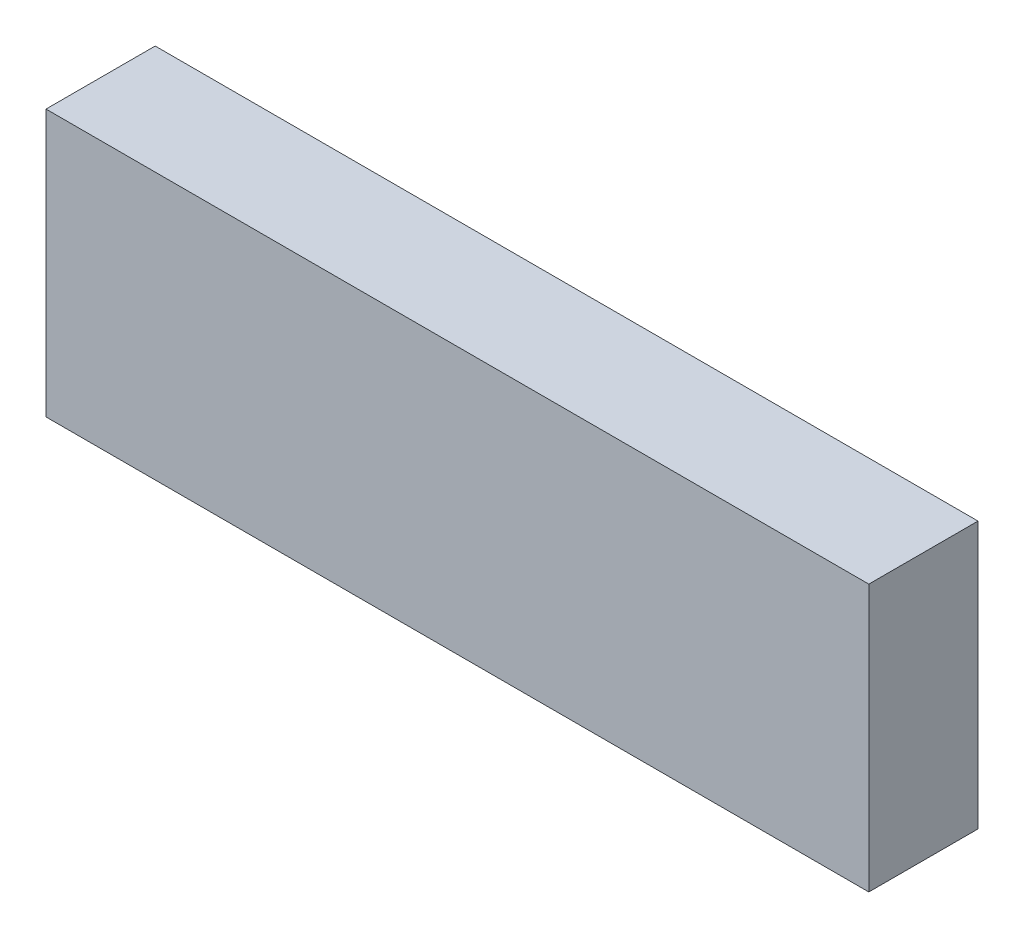
ISO-10303-21;
HEADER;
FILE_DESCRIPTION(('STEP AP214'),'2;1');
FILE_NAME('part.step','',(''),(''),'','','');
FILE_SCHEMA(('AUTOMOTIVE_DESIGN { 1 0 10303 214 1 1 1 1 }'));
ENDSEC;
DATA;
#1=APPLICATION_CONTEXT('core data for automotive mechanical design processes');
#2=APPLICATION_PROTOCOL_DEFINITION('international standard','automotive_design',2000,#1);
#3=PRODUCT_CONTEXT('',#1,'mechanical');
#4=PRODUCT('Part','Part','',(#3));
#5=PRODUCT_RELATED_PRODUCT_CATEGORY('part','',(#4));
#6=PRODUCT_DEFINITION_FORMATION('','',#4);
#7=PRODUCT_DEFINITION_CONTEXT('part definition',#1,'design');
#8=PRODUCT_DEFINITION('design','',#6,#7);
#9=PRODUCT_DEFINITION_SHAPE('','',#8);
#10=(LENGTH_UNIT() NAMED_UNIT(*) SI_UNIT(.MILLI.,.METRE.));
#11=(NAMED_UNIT(*) PLANE_ANGLE_UNIT() SI_UNIT($,.RADIAN.));
#12=(NAMED_UNIT(*) SI_UNIT($,.STERADIAN.) SOLID_ANGLE_UNIT());
#13=UNCERTAINTY_MEASURE_WITH_UNIT(LENGTH_MEASURE(1.E-05),#10,'distance_accuracy_value','');
#14=(GEOMETRIC_REPRESENTATION_CONTEXT(3) GLOBAL_UNCERTAINTY_ASSIGNED_CONTEXT((#13)) GLOBAL_UNIT_ASSIGNED_CONTEXT((#10,
#11,#12)) REPRESENTATION_CONTEXT('',''));
#15=CARTESIAN_POINT('',(0.,0.,0.));
#16=DIRECTION('',(0.,0.,1.));
#17=DIRECTION('',(1.,0.,0.));
#18=AXIS2_PLACEMENT_3D('',#15,#16,#17);
#19=CARTESIAN_POINT('',(9.035088117733,0.363372093023,0.05));
#20=DIRECTION('',(0.,0.,1.));
#21=DIRECTION('',(1.,0.,0.));
#22=AXIS2_PLACEMENT_3D('',#19,#20,#21);
#23=PLANE('',#22);
#24=DIRECTION('',(0.,1.,0.));
#25=VECTOR('',#24,1.);
#26=CARTESIAN_POINT('',(8.846702398256,0.302325581395,0.05));
#27=LINE('',#26,#25);
#28=CARTESIAN_POINT('',(8.846702398256,0.302325581395,0.05));
#29=VERTEX_POINT('',#28);
#30=CARTESIAN_POINT('',(8.846702398256,0.424418604651,0.05));
#31=VERTEX_POINT('',#30);
#32=EDGE_CURVE('E83',#29,#31,#27,.T.);
#33=ORIENTED_EDGE('',*,*,#32,.F.);
#34=DIRECTION('',(-1.,0.,0.));
#35=VECTOR('',#34,1.);
#36=CARTESIAN_POINT('',(9.223473837209,0.302325581395,0.05));
#37=LINE('',#36,#35);
#38=CARTESIAN_POINT('',(9.223473837209,0.302325581395,0.05));
#39=VERTEX_POINT('',#38);
#40=EDGE_CURVE('E72',#39,#29,#37,.T.);
#41=ORIENTED_EDGE('',*,*,#40,.F.);
#42=DIRECTION('',(0.,-1.,0.));
#43=VECTOR('',#42,1.);
#44=CARTESIAN_POINT('',(9.223473837209,0.424418604651,0.05));
#45=LINE('',#44,#43);
#46=CARTESIAN_POINT('',(9.223473837209,0.424418604651,0.05));
#47=VERTEX_POINT('',#46);
#48=EDGE_CURVE('E102',#47,#39,#45,.T.);
#49=ORIENTED_EDGE('',*,*,#48,.F.);
#50=DIRECTION('',(1.,0.,0.));
#51=VECTOR('',#50,1.);
#52=CARTESIAN_POINT('',(8.846702398256,0.424418604651,0.05));
#53=LINE('',#52,#51);
#54=EDGE_CURVE('E28',#31,#47,#53,.T.);
#55=ORIENTED_EDGE('',*,*,#54,.F.);
#56=EDGE_LOOP('',(#33,#41,#49,#55));
#57=FACE_BOUND('',#56,.T.);
#58=ADVANCED_FACE('F17',(#57),#23,.T.);
#59=CARTESIAN_POINT('',(9.035088117733,0.363372093023,0.));
#60=DIRECTION('',(0.,0.,1.));
#61=DIRECTION('',(1.,0.,0.));
#62=AXIS2_PLACEMENT_3D('',#59,#60,#61);
#63=PLANE('',#62);
#64=DIRECTION('',(1.,0.,0.));
#65=VECTOR('',#64,1.);
#66=CARTESIAN_POINT('',(8.846702398256,0.424418604651,0.));
#67=LINE('',#66,#65);
#68=CARTESIAN_POINT('',(8.846702398256,0.424418604651,0.));
#69=VERTEX_POINT('',#68);
#70=CARTESIAN_POINT('',(9.223473837209,0.424418604651,0.));
#71=VERTEX_POINT('',#70);
#72=EDGE_CURVE('E11',#69,#71,#67,.T.);
#73=ORIENTED_EDGE('',*,*,#72,.T.);
#74=DIRECTION('',(0.,-1.,0.));
#75=VECTOR('',#74,1.);
#76=CARTESIAN_POINT('',(9.223473837209,0.424418604651,0.));
#77=LINE('',#76,#75);
#78=CARTESIAN_POINT('',(9.223473837209,0.302325581395,0.));
#79=VERTEX_POINT('',#78);
#80=EDGE_CURVE('E99',#71,#79,#77,.T.);
#81=ORIENTED_EDGE('',*,*,#80,.T.);
#82=DIRECTION('',(-1.,0.,0.));
#83=VECTOR('',#82,1.);
#84=CARTESIAN_POINT('',(9.223473837209,0.302325581395,0.));
#85=LINE('',#84,#83);
#86=CARTESIAN_POINT('',(8.846702398256,0.302325581395,0.));
#87=VERTEX_POINT('',#86);
#88=EDGE_CURVE('E80',#79,#87,#85,.T.);
#89=ORIENTED_EDGE('',*,*,#88,.T.);
#90=DIRECTION('',(0.,1.,0.));
#91=VECTOR('',#90,1.);
#92=CARTESIAN_POINT('',(8.846702398256,0.302325581395,0.));
#93=LINE('',#92,#91);
#94=EDGE_CURVE('E21',#87,#69,#93,.T.);
#95=ORIENTED_EDGE('',*,*,#94,.T.);
#96=EDGE_LOOP('',(#73,#81,#89,#95));
#97=FACE_BOUND('',#96,.T.);
#98=ADVANCED_FACE('F117',(#97),#63,.F.);
#99=CARTESIAN_POINT('',(8.846702398256,0.424418604651,0.));
#100=DIRECTION('',(0.,1.,0.));
#101=DIRECTION('',(1.,0.,0.));
#102=AXIS2_PLACEMENT_3D('',#99,#100,#101);
#103=PLANE('',#102);
#104=DIRECTION('',(0.,0.,1.));
#105=VECTOR('',#104,1.);
#106=CARTESIAN_POINT('',(8.846702398256,0.424418604651,0.));
#107=LINE('',#106,#105);
#108=EDGE_CURVE('E87',#69,#31,#107,.T.);
#109=ORIENTED_EDGE('',*,*,#108,.T.);
#110=ORIENTED_EDGE('',*,*,#54,.T.);
#111=DIRECTION('',(0.,0.,1.));
#112=VECTOR('',#111,1.);
#113=CARTESIAN_POINT('',(9.223473837209,0.424418604651,0.));
#114=LINE('',#113,#112);
#115=EDGE_CURVE('E97',#71,#47,#114,.T.);
#116=ORIENTED_EDGE('',*,*,#115,.F.);
#117=ORIENTED_EDGE('',*,*,#72,.F.);
#118=EDGE_LOOP('',(#109,#110,#116,#117));
#119=FACE_BOUND('',#118,.T.);
#120=ADVANCED_FACE('F120',(#119),#103,.T.);
#121=CARTESIAN_POINT('',(9.223473837209,0.424418604651,0.));
#122=DIRECTION('',(1.,0.,0.));
#123=DIRECTION('',(0.,1.,0.));
#124=AXIS2_PLACEMENT_3D('',#121,#122,#123);
#125=PLANE('',#124);
#126=ORIENTED_EDGE('',*,*,#115,.T.);
#127=ORIENTED_EDGE('',*,*,#48,.T.);
#128=DIRECTION('',(0.,0.,1.));
#129=VECTOR('',#128,1.);
#130=CARTESIAN_POINT('',(9.223473837209,0.302325581395,0.));
#131=LINE('',#130,#129);
#132=EDGE_CURVE('E78',#79,#39,#131,.T.);
#133=ORIENTED_EDGE('',*,*,#132,.F.);
#134=ORIENTED_EDGE('',*,*,#80,.F.);
#135=EDGE_LOOP('',(#126,#127,#133,#134));
#136=FACE_BOUND('',#135,.T.);
#137=ADVANCED_FACE('F19',(#136),#125,.T.);
#138=CARTESIAN_POINT('',(9.223473837209,0.302325581395,0.));
#139=DIRECTION('',(0.,-1.,0.));
#140=DIRECTION('',(0.,0.,-1.));
#141=AXIS2_PLACEMENT_3D('',#138,#139,#140);
#142=PLANE('',#141);
#143=ORIENTED_EDGE('',*,*,#132,.T.);
#144=ORIENTED_EDGE('',*,*,#40,.T.);
#145=DIRECTION('',(0.,0.,1.));
#146=VECTOR('',#145,1.);
#147=CARTESIAN_POINT('',(8.846702398256,0.302325581395,0.));
#148=LINE('',#147,#146);
#149=EDGE_CURVE('E76',#87,#29,#148,.T.);
#150=ORIENTED_EDGE('',*,*,#149,.F.);
#151=ORIENTED_EDGE('',*,*,#88,.F.);
#152=EDGE_LOOP('',(#143,#144,#150,#151));
#153=FACE_BOUND('',#152,.T.);
#154=ADVANCED_FACE('F73',(#153),#142,.T.);
#155=CARTESIAN_POINT('',(8.846702398256,0.302325581395,0.));
#156=DIRECTION('',(-1.,0.,0.));
#157=DIRECTION('',(0.,0.,1.));
#158=AXIS2_PLACEMENT_3D('',#155,#156,#157);
#159=PLANE('',#158);
#160=ORIENTED_EDGE('',*,*,#149,.T.);
#161=ORIENTED_EDGE('',*,*,#32,.T.);
#162=ORIENTED_EDGE('',*,*,#108,.F.);
#163=ORIENTED_EDGE('',*,*,#94,.F.);
#164=EDGE_LOOP('',(#160,#161,#162,#163));
#165=FACE_BOUND('',#164,.T.);
#166=ADVANCED_FACE('F90',(#165),#159,.T.);
#167=CLOSED_SHELL('',(#58,#98,#120,#137,#154,#166));
#168=MANIFOLD_SOLID_BREP('B1',#167);
#169=ADVANCED_BREP_SHAPE_REPRESENTATION('',(#18,#168),#14);
#170=SHAPE_DEFINITION_REPRESENTATION(#9,#169);
ENDSEC;
END-ISO-10303-21;
